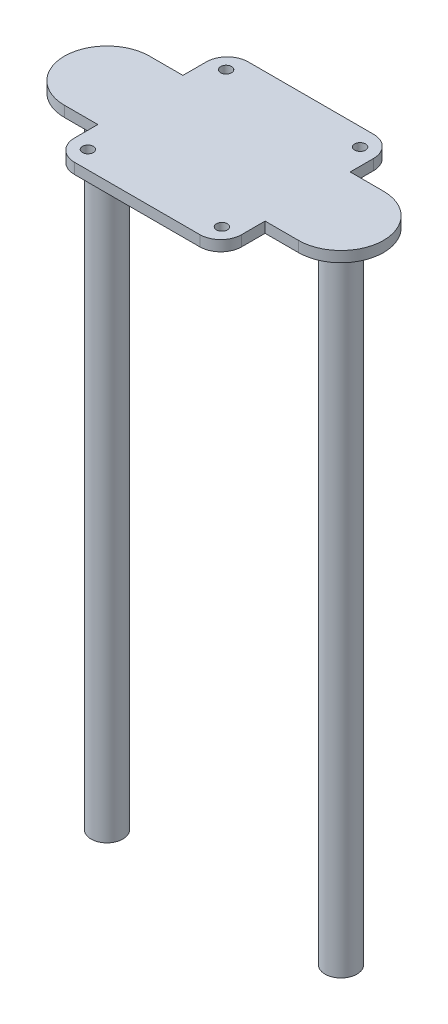
ISO-10303-21;
HEADER;
FILE_DESCRIPTION(('STEP AP214'),'2;1');
FILE_NAME('part.step','',(''),(''),'','','');
FILE_SCHEMA(('AUTOMOTIVE_DESIGN { 1 0 10303 214 1 1 1 1 }'));
ENDSEC;
DATA;
#1=APPLICATION_CONTEXT('core data for automotive mechanical design processes');
#2=APPLICATION_PROTOCOL_DEFINITION('international standard','automotive_design',2000,#1);
#3=PRODUCT_CONTEXT('',#1,'mechanical');
#4=PRODUCT('Part','Part','',(#3));
#5=PRODUCT_RELATED_PRODUCT_CATEGORY('part','',(#4));
#6=PRODUCT_DEFINITION_FORMATION('','',#4);
#7=PRODUCT_DEFINITION_CONTEXT('part definition',#1,'design');
#8=PRODUCT_DEFINITION('design','',#6,#7);
#9=PRODUCT_DEFINITION_SHAPE('','',#8);
#10=(LENGTH_UNIT() NAMED_UNIT(*) SI_UNIT(.MILLI.,.METRE.));
#11=(NAMED_UNIT(*) PLANE_ANGLE_UNIT() SI_UNIT($,.RADIAN.));
#12=(NAMED_UNIT(*) SI_UNIT($,.STERADIAN.) SOLID_ANGLE_UNIT());
#13=UNCERTAINTY_MEASURE_WITH_UNIT(LENGTH_MEASURE(1.E-05),#10,'distance_accuracy_value','');
#14=(GEOMETRIC_REPRESENTATION_CONTEXT(3) GLOBAL_UNCERTAINTY_ASSIGNED_CONTEXT((#13)) GLOBAL_UNIT_ASSIGNED_CONTEXT((#10,
#11,#12)) REPRESENTATION_CONTEXT('',''));
#15=CARTESIAN_POINT('',(0.,0.,0.));
#16=DIRECTION('',(0.,0.,1.));
#17=DIRECTION('',(1.,0.,0.));
#18=AXIS2_PLACEMENT_3D('',#15,#16,#17);
#19=CARTESIAN_POINT('',(-27.94,2.54,0.));
#20=DIRECTION('',(0.,-1.,0.));
#21=DIRECTION('',(0.,0.,-1.));
#22=AXIS2_PLACEMENT_3D('',#19,#20,#21);
#23=CYLINDRICAL_SURFACE('',#22,10.16);
#24=CARTESIAN_POINT('',(-27.94,0.,0.));
#25=DIRECTION('',(0.,1.,0.));
#26=DIRECTION('',(0.,0.,1.));
#27=AXIS2_PLACEMENT_3D('',#24,#25,#26);
#28=CIRCLE('',#27,10.16);
#29=CARTESIAN_POINT('',(-27.94,0.,10.16));
#30=VERTEX_POINT('',#29);
#31=CARTESIAN_POINT('',(-27.94,0.,-10.16));
#32=VERTEX_POINT('',#31);
#33=EDGE_CURVE('E189',#30,#32,#28,.F.);
#34=ORIENTED_EDGE('',*,*,#33,.F.);
#35=DIRECTION('',(0.,-1.,0.));
#36=VECTOR('',#35,1.);
#37=CARTESIAN_POINT('',(-27.94,2.54,10.16));
#38=LINE('',#37,#36);
#39=CARTESIAN_POINT('',(-27.94,2.54,10.16));
#40=VERTEX_POINT('',#39);
#41=EDGE_CURVE('E11',#40,#30,#38,.T.);
#42=ORIENTED_EDGE('',*,*,#41,.F.);
#43=CARTESIAN_POINT('',(-27.94,2.54,0.));
#44=DIRECTION('',(0.,1.,0.));
#45=DIRECTION('',(0.,0.,1.));
#46=AXIS2_PLACEMENT_3D('',#43,#44,#45);
#47=CIRCLE('',#46,10.16);
#48=CARTESIAN_POINT('',(-27.94,2.54,-10.16));
#49=VERTEX_POINT('',#48);
#50=EDGE_CURVE('E242',#40,#49,#47,.F.);
#51=ORIENTED_EDGE('',*,*,#50,.T.);
#52=DIRECTION('',(0.,-1.,0.));
#53=VECTOR('',#52,1.);
#54=CARTESIAN_POINT('',(-27.94,2.54,-10.16));
#55=LINE('',#54,#53);
#56=EDGE_CURVE('E49',#49,#32,#55,.T.);
#57=ORIENTED_EDGE('',*,*,#56,.T.);
#58=EDGE_LOOP('',(#34,#42,#51,#57));
#59=FACE_BOUND('',#58,.T.);
#60=ADVANCED_FACE('F33',(#59),#23,.T.);
#61=CARTESIAN_POINT('',(0.,2.54,10.16));
#62=DIRECTION('',(0.,0.,-1.));
#63=DIRECTION('',(-1.,0.,0.));
#64=AXIS2_PLACEMENT_3D('',#61,#62,#63);
#65=PLANE('',#64);
#66=DIRECTION('',(1.,0.,0.));
#67=VECTOR('',#66,1.);
#68=CARTESIAN_POINT('',(0.,0.,10.16));
#69=LINE('',#68,#67);
#70=CARTESIAN_POINT('',(-19.9694290716853,0.,10.16));
#71=VERTEX_POINT('',#70);
#72=EDGE_CURVE('E191',#30,#71,#69,.T.);
#73=ORIENTED_EDGE('',*,*,#72,.T.);
#74=DIRECTION('',(0.,-1.,0.));
#75=VECTOR('',#74,1.);
#76=CARTESIAN_POINT('',(-19.9694290716853,2.54,10.16));
#77=LINE('',#76,#75);
#78=CARTESIAN_POINT('',(-19.9694290716853,2.54,10.16));
#79=VERTEX_POINT('',#78);
#80=EDGE_CURVE('E41',#79,#71,#77,.T.);
#81=ORIENTED_EDGE('',*,*,#80,.F.);
#82=DIRECTION('',(1.,0.,0.));
#83=VECTOR('',#82,1.);
#84=CARTESIAN_POINT('',(0.,2.54,10.16));
#85=LINE('',#84,#83);
#86=EDGE_CURVE('E433',#40,#79,#85,.T.);
#87=ORIENTED_EDGE('',*,*,#86,.F.);
#88=ORIENTED_EDGE('',*,*,#41,.T.);
#89=EDGE_LOOP('',(#73,#81,#87,#88));
#90=FACE_BOUND('',#89,.T.);
#91=ADVANCED_FACE('F339',(#90),#65,.F.);
#92=CARTESIAN_POINT('',(-19.9694290716853,2.54,0.));
#93=DIRECTION('',(1.,0.,0.));
#94=DIRECTION('',(0.,0.,-1.));
#95=AXIS2_PLACEMENT_3D('',#92,#93,#94);
#96=PLANE('',#95);
#97=DIRECTION('',(0.,0.,1.));
#98=VECTOR('',#97,1.);
#99=CARTESIAN_POINT('',(-19.9694290716853,0.,0.));
#100=LINE('',#99,#98);
#101=CARTESIAN_POINT('',(-19.9694290716853,0.,15.75));
#102=VERTEX_POINT('',#101);
#103=EDGE_CURVE('E194',#71,#102,#100,.T.);
#104=ORIENTED_EDGE('',*,*,#103,.T.);
#105=DIRECTION('',(0.,-1.,0.));
#106=VECTOR('',#105,1.);
#107=CARTESIAN_POINT('',(-19.9694290716853,2.54,15.75));
#108=LINE('',#107,#106);
#109=CARTESIAN_POINT('',(-19.9694290716853,2.54,15.75));
#110=VERTEX_POINT('',#109);
#111=EDGE_CURVE('E266',#110,#102,#108,.T.);
#112=ORIENTED_EDGE('',*,*,#111,.F.);
#113=DIRECTION('',(0.,0.,1.));
#114=VECTOR('',#113,1.);
#115=CARTESIAN_POINT('',(-19.9694290716853,2.54,0.));
#116=LINE('',#115,#114);
#117=EDGE_CURVE('E275',#79,#110,#116,.T.);
#118=ORIENTED_EDGE('',*,*,#117,.F.);
#119=ORIENTED_EDGE('',*,*,#80,.T.);
#120=EDGE_LOOP('',(#104,#112,#118,#119));
#121=FACE_BOUND('',#120,.T.);
#122=ADVANCED_FACE('F273',(#121),#96,.F.);
#123=CARTESIAN_POINT('',(-14.9694290716853,2.54,15.75));
#124=DIRECTION('',(0.,-1.,0.));
#125=DIRECTION('',(0.,0.,-1.));
#126=AXIS2_PLACEMENT_3D('',#123,#124,#125);
#127=CYLINDRICAL_SURFACE('',#126,5.);
#128=CARTESIAN_POINT('',(-14.9694290716853,0.,15.75));
#129=DIRECTION('',(0.,1.,0.));
#130=DIRECTION('',(0.,0.,1.));
#131=AXIS2_PLACEMENT_3D('',#128,#129,#130);
#132=CIRCLE('',#131,5.);
#133=CARTESIAN_POINT('',(-14.9694290716853,0.,20.75));
#134=VERTEX_POINT('',#133);
#135=EDGE_CURVE('E196',#102,#134,#132,.T.);
#136=ORIENTED_EDGE('',*,*,#135,.T.);
#137=DIRECTION('',(0.,-1.,0.));
#138=VECTOR('',#137,1.);
#139=CARTESIAN_POINT('',(-14.9694290716853,2.54,20.75));
#140=LINE('',#139,#138);
#141=CARTESIAN_POINT('',(-14.9694290716853,2.54,20.75));
#142=VERTEX_POINT('',#141);
#143=EDGE_CURVE('E263',#142,#134,#140,.T.);
#144=ORIENTED_EDGE('',*,*,#143,.F.);
#145=CARTESIAN_POINT('',(-14.9694290716853,2.54,15.75));
#146=DIRECTION('',(0.,1.,0.));
#147=DIRECTION('',(0.,0.,1.));
#148=AXIS2_PLACEMENT_3D('',#145,#146,#147);
#149=CIRCLE('',#148,5.);
#150=EDGE_CURVE('E295',#110,#142,#149,.T.);
#151=ORIENTED_EDGE('',*,*,#150,.F.);
#152=ORIENTED_EDGE('',*,*,#111,.T.);
#153=EDGE_LOOP('',(#136,#144,#151,#152));
#154=FACE_BOUND('',#153,.T.);
#155=ADVANCED_FACE('F285',(#154),#127,.T.);
#156=CARTESIAN_POINT('',(0.,2.54,20.75));
#157=DIRECTION('',(0.,0.,-1.));
#158=DIRECTION('',(-1.,0.,0.));
#159=AXIS2_PLACEMENT_3D('',#156,#157,#158);
#160=PLANE('',#159);
#161=DIRECTION('',(1.,0.,0.));
#162=VECTOR('',#161,1.);
#163=CARTESIAN_POINT('',(0.,0.,20.75));
#164=LINE('',#163,#162);
#165=CARTESIAN_POINT('',(14.9694290716853,0.,20.75));
#166=VERTEX_POINT('',#165);
#167=EDGE_CURVE('E198',#134,#166,#164,.T.);
#168=ORIENTED_EDGE('',*,*,#167,.T.);
#169=DIRECTION('',(0.,-1.,0.));
#170=VECTOR('',#169,1.);
#171=CARTESIAN_POINT('',(14.9694290716853,2.54,20.75));
#172=LINE('',#171,#170);
#173=CARTESIAN_POINT('',(14.9694290716853,2.54,20.75));
#174=VERTEX_POINT('',#173);
#175=EDGE_CURVE('E261',#174,#166,#172,.T.);
#176=ORIENTED_EDGE('',*,*,#175,.F.);
#177=DIRECTION('',(1.,0.,0.));
#178=VECTOR('',#177,1.);
#179=CARTESIAN_POINT('',(0.,2.54,20.75));
#180=LINE('',#179,#178);
#181=EDGE_CURVE('E291',#142,#174,#180,.T.);
#182=ORIENTED_EDGE('',*,*,#181,.F.);
#183=ORIENTED_EDGE('',*,*,#143,.T.);
#184=EDGE_LOOP('',(#168,#176,#182,#183));
#185=FACE_BOUND('',#184,.T.);
#186=ADVANCED_FACE('F289',(#185),#160,.F.);
#187=CARTESIAN_POINT('',(14.9694290716853,2.54,15.75));
#188=DIRECTION('',(0.,-1.,0.));
#189=DIRECTION('',(0.,0.,-1.));
#190=AXIS2_PLACEMENT_3D('',#187,#188,#189);
#191=CYLINDRICAL_SURFACE('',#190,5.);
#192=CARTESIAN_POINT('',(14.9694290716853,0.,15.75));
#193=DIRECTION('',(0.,1.,0.));
#194=DIRECTION('',(0.,0.,1.));
#195=AXIS2_PLACEMENT_3D('',#192,#193,#194);
#196=CIRCLE('',#195,5.);
#197=CARTESIAN_POINT('',(19.9694290716853,0.,15.75));
#198=VERTEX_POINT('',#197);
#199=EDGE_CURVE('E201',#198,#166,#196,.F.);
#200=ORIENTED_EDGE('',*,*,#199,.F.);
#201=DIRECTION('',(0.,-1.,0.));
#202=VECTOR('',#201,1.);
#203=CARTESIAN_POINT('',(19.9694290716853,2.54,15.75));
#204=LINE('',#203,#202);
#205=CARTESIAN_POINT('',(19.9694290716853,2.54,15.75));
#206=VERTEX_POINT('',#205);
#207=EDGE_CURVE('E259',#206,#198,#204,.T.);
#208=ORIENTED_EDGE('',*,*,#207,.F.);
#209=CARTESIAN_POINT('',(14.9694290716853,2.54,15.75));
#210=DIRECTION('',(0.,1.,0.));
#211=DIRECTION('',(0.,0.,1.));
#212=AXIS2_PLACEMENT_3D('',#209,#210,#211);
#213=CIRCLE('',#212,5.);
#214=EDGE_CURVE('E294',#206,#174,#213,.F.);
#215=ORIENTED_EDGE('',*,*,#214,.T.);
#216=ORIENTED_EDGE('',*,*,#175,.T.);
#217=EDGE_LOOP('',(#200,#208,#215,#216));
#218=FACE_BOUND('',#217,.T.);
#219=ADVANCED_FACE('F352',(#218),#191,.T.);
#220=CARTESIAN_POINT('',(19.9694290716853,2.54,0.));
#221=DIRECTION('',(1.,0.,0.));
#222=DIRECTION('',(0.,0.,-1.));
#223=AXIS2_PLACEMENT_3D('',#220,#221,#222);
#224=PLANE('',#223);
#225=DIRECTION('',(0.,0.,1.));
#226=VECTOR('',#225,1.);
#227=CARTESIAN_POINT('',(19.9694290716853,0.,0.));
#228=LINE('',#227,#226);
#229=CARTESIAN_POINT('',(19.9694290716853,0.,10.16));
#230=VERTEX_POINT('',#229);
#231=EDGE_CURVE('E204',#230,#198,#228,.T.);
#232=ORIENTED_EDGE('',*,*,#231,.F.);
#233=DIRECTION('',(0.,-1.,0.));
#234=VECTOR('',#233,1.);
#235=CARTESIAN_POINT('',(19.9694290716853,2.54,10.16));
#236=LINE('',#235,#234);
#237=CARTESIAN_POINT('',(19.9694290716853,2.54,10.16));
#238=VERTEX_POINT('',#237);
#239=EDGE_CURVE('E257',#238,#230,#236,.T.);
#240=ORIENTED_EDGE('',*,*,#239,.F.);
#241=DIRECTION('',(0.,0.,1.));
#242=VECTOR('',#241,1.);
#243=CARTESIAN_POINT('',(19.9694290716853,2.54,0.));
#244=LINE('',#243,#242);
#245=EDGE_CURVE('E297',#238,#206,#244,.T.);
#246=ORIENTED_EDGE('',*,*,#245,.T.);
#247=ORIENTED_EDGE('',*,*,#207,.T.);
#248=EDGE_LOOP('',(#232,#240,#246,#247));
#249=FACE_BOUND('',#248,.T.);
#250=ADVANCED_FACE('F355',(#249),#224,.T.);
#251=CARTESIAN_POINT('',(0.,2.54,10.16));
#252=DIRECTION('',(0.,0.,-1.));
#253=DIRECTION('',(-1.,0.,0.));
#254=AXIS2_PLACEMENT_3D('',#251,#252,#253);
#255=PLANE('',#254);
#256=DIRECTION('',(1.,0.,0.));
#257=VECTOR('',#256,1.);
#258=CARTESIAN_POINT('',(0.,0.,10.16));
#259=LINE('',#258,#257);
#260=CARTESIAN_POINT('',(27.94,0.,10.16));
#261=VERTEX_POINT('',#260);
#262=EDGE_CURVE('E207',#230,#261,#259,.T.);
#263=ORIENTED_EDGE('',*,*,#262,.T.);
#264=DIRECTION('',(0.,-1.,0.));
#265=VECTOR('',#264,1.);
#266=CARTESIAN_POINT('',(27.94,2.54,10.16));
#267=LINE('',#266,#265);
#268=CARTESIAN_POINT('',(27.94,2.54,10.16));
#269=VERTEX_POINT('',#268);
#270=EDGE_CURVE('E254',#269,#261,#267,.T.);
#271=ORIENTED_EDGE('',*,*,#270,.F.);
#272=DIRECTION('',(1.,0.,0.));
#273=VECTOR('',#272,1.);
#274=CARTESIAN_POINT('',(0.,2.54,10.16));
#275=LINE('',#274,#273);
#276=EDGE_CURVE('E304',#238,#269,#275,.T.);
#277=ORIENTED_EDGE('',*,*,#276,.F.);
#278=ORIENTED_EDGE('',*,*,#239,.T.);
#279=EDGE_LOOP('',(#263,#271,#277,#278));
#280=FACE_BOUND('',#279,.T.);
#281=ADVANCED_FACE('F359',(#280),#255,.F.);
#282=CARTESIAN_POINT('',(27.94,2.54,0.));
#283=DIRECTION('',(0.,-1.,0.));
#284=DIRECTION('',(0.,0.,-1.));
#285=AXIS2_PLACEMENT_3D('',#282,#283,#284);
#286=CYLINDRICAL_SURFACE('',#285,10.16);
#287=CARTESIAN_POINT('',(27.94,0.,0.));
#288=DIRECTION('',(0.,1.,0.));
#289=DIRECTION('',(0.,0.,1.));
#290=AXIS2_PLACEMENT_3D('',#287,#288,#289);
#291=CIRCLE('',#290,10.16);
#292=CARTESIAN_POINT('',(27.94,0.,-10.16));
#293=VERTEX_POINT('',#292);
#294=EDGE_CURVE('E209',#261,#293,#291,.T.);
#295=ORIENTED_EDGE('',*,*,#294,.T.);
#296=DIRECTION('',(0.,-1.,0.));
#297=VECTOR('',#296,1.);
#298=CARTESIAN_POINT('',(27.94,2.54,-10.16));
#299=LINE('',#298,#297);
#300=CARTESIAN_POINT('',(27.94,2.54,-10.16));
#301=VERTEX_POINT('',#300);
#302=EDGE_CURVE('E252',#301,#293,#299,.T.);
#303=ORIENTED_EDGE('',*,*,#302,.F.);
#304=CARTESIAN_POINT('',(27.94,2.54,0.));
#305=DIRECTION('',(0.,1.,0.));
#306=DIRECTION('',(0.,0.,1.));
#307=AXIS2_PLACEMENT_3D('',#304,#305,#306);
#308=CIRCLE('',#307,10.16);
#309=EDGE_CURVE('E306',#269,#301,#308,.T.);
#310=ORIENTED_EDGE('',*,*,#309,.F.);
#311=ORIENTED_EDGE('',*,*,#270,.T.);
#312=EDGE_LOOP('',(#295,#303,#310,#311));
#313=FACE_BOUND('',#312,.T.);
#314=ADVANCED_FACE('F363',(#313),#286,.T.);
#315=CARTESIAN_POINT('',(0.,2.54,-10.16));
#316=DIRECTION('',(0.,0.,-1.));
#317=DIRECTION('',(-1.,0.,0.));
#318=AXIS2_PLACEMENT_3D('',#315,#316,#317);
#319=PLANE('',#318);
#320=DIRECTION('',(1.,0.,0.));
#321=VECTOR('',#320,1.);
#322=CARTESIAN_POINT('',(0.,0.,-10.16));
#323=LINE('',#322,#321);
#324=CARTESIAN_POINT('',(19.9694290716853,0.,-10.16));
#325=VERTEX_POINT('',#324);
#326=EDGE_CURVE('E212',#325,#293,#323,.T.);
#327=ORIENTED_EDGE('',*,*,#326,.F.);
#328=DIRECTION('',(0.,-1.,0.));
#329=VECTOR('',#328,1.);
#330=CARTESIAN_POINT('',(19.9694290716853,2.54,-10.16));
#331=LINE('',#330,#329);
#332=CARTESIAN_POINT('',(19.9694290716853,2.54,-10.16));
#333=VERTEX_POINT('',#332);
#334=EDGE_CURVE('E250',#333,#325,#331,.T.);
#335=ORIENTED_EDGE('',*,*,#334,.F.);
#336=DIRECTION('',(1.,0.,0.));
#337=VECTOR('',#336,1.);
#338=CARTESIAN_POINT('',(0.,2.54,-10.16));
#339=LINE('',#338,#337);
#340=EDGE_CURVE('E308',#333,#301,#339,.T.);
#341=ORIENTED_EDGE('',*,*,#340,.T.);
#342=ORIENTED_EDGE('',*,*,#302,.T.);
#343=EDGE_LOOP('',(#327,#335,#341,#342));
#344=FACE_BOUND('',#343,.T.);
#345=ADVANCED_FACE('F367',(#344),#319,.T.);
#346=CARTESIAN_POINT('',(19.9694290716853,2.54,0.));
#347=DIRECTION('',(1.,0.,0.));
#348=DIRECTION('',(0.,0.,-1.));
#349=AXIS2_PLACEMENT_3D('',#346,#347,#348);
#350=PLANE('',#349);
#351=DIRECTION('',(0.,0.,1.));
#352=VECTOR('',#351,1.);
#353=CARTESIAN_POINT('',(19.9694290716853,0.,0.));
#354=LINE('',#353,#352);
#355=CARTESIAN_POINT('',(19.9694290716853,0.,-15.75));
#356=VERTEX_POINT('',#355);
#357=EDGE_CURVE('E215',#356,#325,#354,.T.);
#358=ORIENTED_EDGE('',*,*,#357,.F.);
#359=DIRECTION('',(0.,-1.,0.));
#360=VECTOR('',#359,1.);
#361=CARTESIAN_POINT('',(19.9694290716853,2.54,-15.75));
#362=LINE('',#361,#360);
#363=CARTESIAN_POINT('',(19.9694290716853,2.54,-15.75));
#364=VERTEX_POINT('',#363);
#365=EDGE_CURVE('E248',#364,#356,#362,.T.);
#366=ORIENTED_EDGE('',*,*,#365,.F.);
#367=DIRECTION('',(0.,0.,1.));
#368=VECTOR('',#367,1.);
#369=CARTESIAN_POINT('',(19.9694290716853,2.54,0.));
#370=LINE('',#369,#368);
#371=EDGE_CURVE('E311',#364,#333,#370,.T.);
#372=ORIENTED_EDGE('',*,*,#371,.T.);
#373=ORIENTED_EDGE('',*,*,#334,.T.);
#374=EDGE_LOOP('',(#358,#366,#372,#373));
#375=FACE_BOUND('',#374,.T.);
#376=ADVANCED_FACE('F371',(#375),#350,.T.);
#377=CARTESIAN_POINT('',(14.9694290716853,2.54,-15.75));
#378=DIRECTION('',(0.,-1.,0.));
#379=DIRECTION('',(0.,0.,-1.));
#380=AXIS2_PLACEMENT_3D('',#377,#378,#379);
#381=CYLINDRICAL_SURFACE('',#380,5.);
#382=CARTESIAN_POINT('',(14.9694290716853,0.,-15.75));
#383=DIRECTION('',(0.,1.,0.));
#384=DIRECTION('',(0.,0.,1.));
#385=AXIS2_PLACEMENT_3D('',#382,#383,#384);
#386=CIRCLE('',#385,5.);
#387=CARTESIAN_POINT('',(14.9694290716853,0.,-20.75));
#388=VERTEX_POINT('',#387);
#389=EDGE_CURVE('E218',#356,#388,#386,.T.);
#390=ORIENTED_EDGE('',*,*,#389,.T.);
#391=DIRECTION('',(0.,-1.,0.));
#392=VECTOR('',#391,1.);
#393=CARTESIAN_POINT('',(14.9694290716853,2.54,-20.75));
#394=LINE('',#393,#392);
#395=CARTESIAN_POINT('',(14.9694290716853,2.54,-20.75));
#396=VERTEX_POINT('',#395);
#397=EDGE_CURVE('E246',#396,#388,#394,.T.);
#398=ORIENTED_EDGE('',*,*,#397,.F.);
#399=CARTESIAN_POINT('',(14.9694290716853,2.54,-15.75));
#400=DIRECTION('',(0.,1.,0.));
#401=DIRECTION('',(0.,0.,1.));
#402=AXIS2_PLACEMENT_3D('',#399,#400,#401);
#403=CIRCLE('',#402,5.);
#404=EDGE_CURVE('E172',#364,#396,#403,.T.);
#405=ORIENTED_EDGE('',*,*,#404,.F.);
#406=ORIENTED_EDGE('',*,*,#365,.T.);
#407=EDGE_LOOP('',(#390,#398,#405,#406));
#408=FACE_BOUND('',#407,.T.);
#409=ADVANCED_FACE('F318',(#408),#381,.T.);
#410=CARTESIAN_POINT('',(0.,2.54,-20.75));
#411=DIRECTION('',(0.,0.,-1.));
#412=DIRECTION('',(-1.,0.,0.));
#413=AXIS2_PLACEMENT_3D('',#410,#411,#412);
#414=PLANE('',#413);
#415=DIRECTION('',(1.,0.,0.));
#416=VECTOR('',#415,1.);
#417=CARTESIAN_POINT('',(0.,0.,-20.75));
#418=LINE('',#417,#416);
#419=CARTESIAN_POINT('',(-14.9694290716853,0.,-20.75));
#420=VERTEX_POINT('',#419);
#421=EDGE_CURVE('E221',#420,#388,#418,.T.);
#422=ORIENTED_EDGE('',*,*,#421,.F.);
#423=DIRECTION('',(0.,-1.,0.));
#424=VECTOR('',#423,1.);
#425=CARTESIAN_POINT('',(-14.9694290716853,2.54,-20.75));
#426=LINE('',#425,#424);
#427=CARTESIAN_POINT('',(-14.9694290716853,2.54,-20.75));
#428=VERTEX_POINT('',#427);
#429=EDGE_CURVE('E157',#428,#420,#426,.T.);
#430=ORIENTED_EDGE('',*,*,#429,.F.);
#431=DIRECTION('',(1.,0.,0.));
#432=VECTOR('',#431,1.);
#433=CARTESIAN_POINT('',(0.,2.54,-20.75));
#434=LINE('',#433,#432);
#435=EDGE_CURVE('E170',#428,#396,#434,.T.);
#436=ORIENTED_EDGE('',*,*,#435,.T.);
#437=ORIENTED_EDGE('',*,*,#397,.T.);
#438=EDGE_LOOP('',(#422,#430,#436,#437));
#439=FACE_BOUND('',#438,.T.);
#440=ADVANCED_FACE('F322',(#439),#414,.T.);
#441=CARTESIAN_POINT('',(-14.9694290716853,2.54,-15.75));
#442=DIRECTION('',(0.,-1.,0.));
#443=DIRECTION('',(0.,0.,-1.));
#444=AXIS2_PLACEMENT_3D('',#441,#442,#443);
#445=CYLINDRICAL_SURFACE('',#444,5.);
#446=CARTESIAN_POINT('',(-14.9694290716853,0.,-15.75));
#447=DIRECTION('',(0.,1.,0.));
#448=DIRECTION('',(0.,0.,1.));
#449=AXIS2_PLACEMENT_3D('',#446,#447,#448);
#450=CIRCLE('',#449,5.);
#451=CARTESIAN_POINT('',(-19.9694290716853,0.,-15.75));
#452=VERTEX_POINT('',#451);
#453=EDGE_CURVE('E154',#452,#420,#450,.F.);
#454=ORIENTED_EDGE('',*,*,#453,.F.);
#455=DIRECTION('',(0.,-1.,0.));
#456=VECTOR('',#455,1.);
#457=CARTESIAN_POINT('',(-19.9694290716853,2.54,-15.75));
#458=LINE('',#457,#456);
#459=CARTESIAN_POINT('',(-19.9694290716853,2.54,-15.75));
#460=VERTEX_POINT('',#459);
#461=EDGE_CURVE('E148',#460,#452,#458,.T.);
#462=ORIENTED_EDGE('',*,*,#461,.F.);
#463=CARTESIAN_POINT('',(-14.9694290716853,2.54,-15.75));
#464=DIRECTION('',(0.,1.,0.));
#465=DIRECTION('',(0.,0.,1.));
#466=AXIS2_PLACEMENT_3D('',#463,#464,#465);
#467=CIRCLE('',#466,5.);
#468=EDGE_CURVE('E152',#460,#428,#467,.F.);
#469=ORIENTED_EDGE('',*,*,#468,.T.);
#470=ORIENTED_EDGE('',*,*,#429,.T.);
#471=EDGE_LOOP('',(#454,#462,#469,#470));
#472=FACE_BOUND('',#471,.T.);
#473=ADVANCED_FACE('F150',(#472),#445,.T.);
#474=CARTESIAN_POINT('',(-19.9694290716853,2.54,0.));
#475=DIRECTION('',(1.,0.,0.));
#476=DIRECTION('',(0.,0.,-1.));
#477=AXIS2_PLACEMENT_3D('',#474,#475,#476);
#478=PLANE('',#477);
#479=DIRECTION('',(0.,0.,1.));
#480=VECTOR('',#479,1.);
#481=CARTESIAN_POINT('',(-19.9694290716853,0.,0.));
#482=LINE('',#481,#480);
#483=CARTESIAN_POINT('',(-19.9694290716853,0.,-10.16));
#484=VERTEX_POINT('',#483);
#485=EDGE_CURVE('E225',#452,#484,#482,.T.);
#486=ORIENTED_EDGE('',*,*,#485,.T.);
#487=DIRECTION('',(0.,-1.,0.));
#488=VECTOR('',#487,1.);
#489=CARTESIAN_POINT('',(-19.9694290716853,2.54,-10.16));
#490=LINE('',#489,#488);
#491=CARTESIAN_POINT('',(-19.9694290716853,2.54,-10.16));
#492=VERTEX_POINT('',#491);
#493=EDGE_CURVE('E99',#492,#484,#490,.T.);
#494=ORIENTED_EDGE('',*,*,#493,.F.);
#495=DIRECTION('',(0.,0.,1.));
#496=VECTOR('',#495,1.);
#497=CARTESIAN_POINT('',(-19.9694290716853,2.54,0.));
#498=LINE('',#497,#496);
#499=EDGE_CURVE('E159',#460,#492,#498,.T.);
#500=ORIENTED_EDGE('',*,*,#499,.F.);
#501=ORIENTED_EDGE('',*,*,#461,.T.);
#502=EDGE_LOOP('',(#486,#494,#500,#501));
#503=FACE_BOUND('',#502,.T.);
#504=ADVANCED_FACE('F160',(#503),#478,.F.);
#505=CARTESIAN_POINT('',(-16.,2.54,-16.5));
#506=DIRECTION('',(0.,-1.,0.));
#507=DIRECTION('',(0.,0.,-1.));
#508=AXIS2_PLACEMENT_3D('',#505,#506,#507);
#509=CYLINDRICAL_SURFACE('',#508,1.30000000000001);
#510=CARTESIAN_POINT('',(-16.,2.54,-16.5));
#511=DIRECTION('',(0.,1.,0.));
#512=DIRECTION('',(0.,0.,1.));
#513=AXIS2_PLACEMENT_3D('',#510,#511,#512);
#514=CIRCLE('',#513,1.30000000000001);
#515=CARTESIAN_POINT('',(-16.,2.54,-15.2));
#516=VERTEX_POINT('',#515);
#517=EDGE_CURVE('E183',#516,#516,#514,.T.);
#518=ORIENTED_EDGE('',*,*,#517,.T.);
#519=EDGE_LOOP('',(#518));
#520=FACE_BOUND('',#519,.T.);
#521=CARTESIAN_POINT('',(-16.,0.,-16.5));
#522=DIRECTION('',(0.,1.,0.));
#523=DIRECTION('',(0.,0.,1.));
#524=AXIS2_PLACEMENT_3D('',#521,#522,#523);
#525=CIRCLE('',#524,1.30000000000001);
#526=CARTESIAN_POINT('',(-16.,0.,-15.2));
#527=VERTEX_POINT('',#526);
#528=EDGE_CURVE('E236',#527,#527,#525,.T.);
#529=ORIENTED_EDGE('',*,*,#528,.F.);
#530=EDGE_LOOP('',(#529));
#531=FACE_BOUND('',#530,.T.);
#532=ADVANCED_FACE('F382',(#520,#531),#509,.F.);
#533=CARTESIAN_POINT('',(-16.,2.54,16.5));
#534=DIRECTION('',(0.,-1.,0.));
#535=DIRECTION('',(0.,0.,-1.));
#536=AXIS2_PLACEMENT_3D('',#533,#534,#535);
#537=CYLINDRICAL_SURFACE('',#536,1.3);
#538=CARTESIAN_POINT('',(-16.,2.54,16.5));
#539=DIRECTION('',(0.,1.,0.));
#540=DIRECTION('',(0.,0.,1.));
#541=AXIS2_PLACEMENT_3D('',#538,#539,#540);
#542=CIRCLE('',#541,1.3);
#543=CARTESIAN_POINT('',(-16.,2.54,17.8));
#544=VERTEX_POINT('',#543);
#545=EDGE_CURVE('E180',#544,#544,#542,.T.);
#546=ORIENTED_EDGE('',*,*,#545,.T.);
#547=EDGE_LOOP('',(#546));
#548=FACE_BOUND('',#547,.T.);
#549=CARTESIAN_POINT('',(-16.,0.,16.5));
#550=DIRECTION('',(0.,1.,0.));
#551=DIRECTION('',(0.,0.,1.));
#552=AXIS2_PLACEMENT_3D('',#549,#550,#551);
#553=CIRCLE('',#552,1.3);
#554=CARTESIAN_POINT('',(-16.,0.,17.8));
#555=VERTEX_POINT('',#554);
#556=EDGE_CURVE('E233',#555,#555,#553,.T.);
#557=ORIENTED_EDGE('',*,*,#556,.F.);
#558=EDGE_LOOP('',(#557));
#559=FACE_BOUND('',#558,.T.);
#560=ADVANCED_FACE('F334',(#548,#559),#537,.F.);
#561=CARTESIAN_POINT('',(16.,2.54,16.5));
#562=DIRECTION('',(0.,-1.,0.));
#563=DIRECTION('',(0.,0.,-1.));
#564=AXIS2_PLACEMENT_3D('',#561,#562,#563);
#565=CYLINDRICAL_SURFACE('',#564,1.29999999999999);
#566=CARTESIAN_POINT('',(16.,2.54,16.5));
#567=DIRECTION('',(0.,1.,0.));
#568=DIRECTION('',(0.,0.,1.));
#569=AXIS2_PLACEMENT_3D('',#566,#567,#568);
#570=CIRCLE('',#569,1.29999999999999);
#571=CARTESIAN_POINT('',(16.,2.54,17.8));
#572=VERTEX_POINT('',#571);
#573=EDGE_CURVE('E177',#572,#572,#570,.T.);
#574=ORIENTED_EDGE('',*,*,#573,.T.);
#575=EDGE_LOOP('',(#574));
#576=FACE_BOUND('',#575,.T.);
#577=CARTESIAN_POINT('',(16.,0.,16.5));
#578=DIRECTION('',(0.,1.,0.));
#579=DIRECTION('',(0.,0.,1.));
#580=AXIS2_PLACEMENT_3D('',#577,#578,#579);
#581=CIRCLE('',#580,1.29999999999999);
#582=CARTESIAN_POINT('',(16.,0.,17.8));
#583=VERTEX_POINT('',#582);
#584=EDGE_CURVE('E230',#583,#583,#581,.T.);
#585=ORIENTED_EDGE('',*,*,#584,.F.);
#586=EDGE_LOOP('',(#585));
#587=FACE_BOUND('',#586,.T.);
#588=ADVANCED_FACE('F326',(#576,#587),#565,.F.);
#589=CARTESIAN_POINT('',(0.,2.54,-10.16));
#590=DIRECTION('',(0.,0.,-1.));
#591=DIRECTION('',(-1.,0.,0.));
#592=AXIS2_PLACEMENT_3D('',#589,#590,#591);
#593=PLANE('',#592);
#594=DIRECTION('',(1.,0.,0.));
#595=VECTOR('',#594,1.);
#596=CARTESIAN_POINT('',(0.,0.,-10.16));
#597=LINE('',#596,#595);
#598=EDGE_CURVE('E227',#32,#484,#597,.T.);
#599=ORIENTED_EDGE('',*,*,#598,.F.);
#600=ORIENTED_EDGE('',*,*,#56,.F.);
#601=DIRECTION('',(1.,0.,0.));
#602=VECTOR('',#601,1.);
#603=CARTESIAN_POINT('',(0.,2.54,-10.16));
#604=LINE('',#603,#602);
#605=EDGE_CURVE('E163',#49,#492,#604,.T.);
#606=ORIENTED_EDGE('',*,*,#605,.T.);
#607=ORIENTED_EDGE('',*,*,#493,.T.);
#608=EDGE_LOOP('',(#599,#600,#606,#607));
#609=FACE_BOUND('',#608,.T.);
#610=ADVANCED_FACE('F323',(#609),#593,.T.);
#611=CARTESIAN_POINT('',(16.,2.54,-16.5));
#612=DIRECTION('',(0.,-1.,0.));
#613=DIRECTION('',(0.,0.,-1.));
#614=AXIS2_PLACEMENT_3D('',#611,#612,#613);
#615=CYLINDRICAL_SURFACE('',#614,1.3);
#616=CARTESIAN_POINT('',(16.,2.54,-16.5));
#617=DIRECTION('',(0.,1.,0.));
#618=DIRECTION('',(0.,0.,1.));
#619=AXIS2_PLACEMENT_3D('',#616,#617,#618);
#620=CIRCLE('',#619,1.3);
#621=CARTESIAN_POINT('',(16.,2.54,-15.2));
#622=VERTEX_POINT('',#621);
#623=EDGE_CURVE('E186',#622,#622,#620,.T.);
#624=ORIENTED_EDGE('',*,*,#623,.T.);
#625=EDGE_LOOP('',(#624));
#626=FACE_BOUND('',#625,.T.);
#627=CARTESIAN_POINT('',(16.,0.,-16.5));
#628=DIRECTION('',(0.,1.,0.));
#629=DIRECTION('',(0.,0.,1.));
#630=AXIS2_PLACEMENT_3D('',#627,#628,#629);
#631=CIRCLE('',#630,1.3);
#632=CARTESIAN_POINT('',(16.,0.,-15.2));
#633=VERTEX_POINT('',#632);
#634=EDGE_CURVE('E239',#633,#633,#631,.T.);
#635=ORIENTED_EDGE('',*,*,#634,.F.);
#636=EDGE_LOOP('',(#635));
#637=FACE_BOUND('',#636,.T.);
#638=ADVANCED_FACE('F325',(#626,#637),#615,.F.);
#639=CARTESIAN_POINT('',(0.,2.54,0.));
#640=DIRECTION('',(0.,1.,0.));
#641=DIRECTION('',(0.,0.,1.));
#642=AXIS2_PLACEMENT_3D('',#639,#640,#641);
#643=PLANE('',#642);
#644=ORIENTED_EDGE('',*,*,#50,.F.);
#645=ORIENTED_EDGE('',*,*,#86,.T.);
#646=ORIENTED_EDGE('',*,*,#117,.T.);
#647=ORIENTED_EDGE('',*,*,#150,.T.);
#648=ORIENTED_EDGE('',*,*,#181,.T.);
#649=ORIENTED_EDGE('',*,*,#214,.F.);
#650=ORIENTED_EDGE('',*,*,#245,.F.);
#651=ORIENTED_EDGE('',*,*,#276,.T.);
#652=ORIENTED_EDGE('',*,*,#309,.T.);
#653=ORIENTED_EDGE('',*,*,#340,.F.);
#654=ORIENTED_EDGE('',*,*,#371,.F.);
#655=ORIENTED_EDGE('',*,*,#404,.T.);
#656=ORIENTED_EDGE('',*,*,#435,.F.);
#657=ORIENTED_EDGE('',*,*,#468,.F.);
#658=ORIENTED_EDGE('',*,*,#499,.T.);
#659=ORIENTED_EDGE('',*,*,#605,.F.);
#660=EDGE_LOOP('',(#644,#645,#646,#647,#648,#649,#650,#651,#652,#653,#654,#655,#656,#657,#658,#659));
#661=FACE_BOUND('',#660,.T.);
#662=ORIENTED_EDGE('',*,*,#573,.F.);
#663=EDGE_LOOP('',(#662));
#664=FACE_BOUND('',#663,.T.);
#665=ORIENTED_EDGE('',*,*,#545,.F.);
#666=EDGE_LOOP('',(#665));
#667=FACE_BOUND('',#666,.T.);
#668=ORIENTED_EDGE('',*,*,#517,.F.);
#669=EDGE_LOOP('',(#668));
#670=FACE_BOUND('',#669,.T.);
#671=ORIENTED_EDGE('',*,*,#623,.F.);
#672=EDGE_LOOP('',(#671));
#673=FACE_BOUND('',#672,.T.);
#674=ADVANCED_FACE('F167',(#661,#664,#667,#670,#673),#643,.T.);
#675=CARTESIAN_POINT('',(0.,0.,0.));
#676=DIRECTION('',(0.,1.,0.));
#677=DIRECTION('',(0.,0.,1.));
#678=AXIS2_PLACEMENT_3D('',#675,#676,#677);
#679=PLANE('',#678);
#680=CARTESIAN_POINT('',(-27.94,0.,0.));
#681=DIRECTION('',(0.,1.,0.));
#682=DIRECTION('',(0.,0.,1.));
#683=AXIS2_PLACEMENT_3D('',#680,#681,#682);
#684=CIRCLE('',#683,3.81);
#685=CARTESIAN_POINT('',(-27.94,0.,3.81));
#686=VERTEX_POINT('',#685);
#687=EDGE_CURVE('E423',#686,#686,#684,.T.);
#688=ORIENTED_EDGE('',*,*,#687,.T.);
#689=EDGE_LOOP('',(#688));
#690=FACE_BOUND('',#689,.T.);
#691=CARTESIAN_POINT('',(27.94,0.,0.));
#692=DIRECTION('',(0.,1.,0.));
#693=DIRECTION('',(0.,0.,1.));
#694=AXIS2_PLACEMENT_3D('',#691,#692,#693);
#695=CIRCLE('',#694,3.81);
#696=CARTESIAN_POINT('',(27.94,0.,3.80999999999999));
#697=VERTEX_POINT('',#696);
#698=EDGE_CURVE('E424',#697,#697,#695,.T.);
#699=ORIENTED_EDGE('',*,*,#698,.T.);
#700=EDGE_LOOP('',(#699));
#701=FACE_BOUND('',#700,.T.);
#702=ORIENTED_EDGE('',*,*,#33,.T.);
#703=ORIENTED_EDGE('',*,*,#598,.T.);
#704=ORIENTED_EDGE('',*,*,#485,.F.);
#705=ORIENTED_EDGE('',*,*,#453,.T.);
#706=ORIENTED_EDGE('',*,*,#421,.T.);
#707=ORIENTED_EDGE('',*,*,#389,.F.);
#708=ORIENTED_EDGE('',*,*,#357,.T.);
#709=ORIENTED_EDGE('',*,*,#326,.T.);
#710=ORIENTED_EDGE('',*,*,#294,.F.);
#711=ORIENTED_EDGE('',*,*,#262,.F.);
#712=ORIENTED_EDGE('',*,*,#231,.T.);
#713=ORIENTED_EDGE('',*,*,#199,.T.);
#714=ORIENTED_EDGE('',*,*,#167,.F.);
#715=ORIENTED_EDGE('',*,*,#135,.F.);
#716=ORIENTED_EDGE('',*,*,#103,.F.);
#717=ORIENTED_EDGE('',*,*,#72,.F.);
#718=EDGE_LOOP('',(#702,#703,#704,#705,#706,#707,#708,#709,#710,#711,#712,#713,#714,#715,#716,#717));
#719=FACE_BOUND('',#718,.T.);
#720=ORIENTED_EDGE('',*,*,#584,.T.);
#721=EDGE_LOOP('',(#720));
#722=FACE_BOUND('',#721,.T.);
#723=ORIENTED_EDGE('',*,*,#556,.T.);
#724=EDGE_LOOP('',(#723));
#725=FACE_BOUND('',#724,.T.);
#726=ORIENTED_EDGE('',*,*,#528,.T.);
#727=EDGE_LOOP('',(#726));
#728=FACE_BOUND('',#727,.T.);
#729=ORIENTED_EDGE('',*,*,#634,.T.);
#730=EDGE_LOOP('',(#729));
#731=FACE_BOUND('',#730,.T.);
#732=ADVANCED_FACE('F280',(#690,#701,#719,#722,#725,#728,#731),#679,.F.);
#733=CARTESIAN_POINT('',(27.94,-152.4,0.));
#734=DIRECTION('',(0.,1.,0.));
#735=DIRECTION('',(0.,0.,1.));
#736=AXIS2_PLACEMENT_3D('',#733,#734,#735);
#737=CYLINDRICAL_SURFACE('',#736,3.81);
#738=CARTESIAN_POINT('',(27.94,-152.4,0.));
#739=DIRECTION('',(0.,1.,0.));
#740=DIRECTION('',(0.,0.,1.));
#741=AXIS2_PLACEMENT_3D('',#738,#739,#740);
#742=CIRCLE('',#741,3.81);
#743=CARTESIAN_POINT('',(27.94,-152.4,3.80999999999999));
#744=VERTEX_POINT('',#743);
#745=EDGE_CURVE('E192',#744,#744,#742,.T.);
#746=CARTESIAN_POINT('',(27.94,-152.4,3.80999999999999));
#747=CARTESIAN_POINT('',(27.94,-150.8125,3.80999999999999));
#748=CARTESIAN_POINT('',(27.94,-149.225,3.80999999999999));
#749=CARTESIAN_POINT('',(27.94,-146.05,3.80999999999999));
#750=CARTESIAN_POINT('',(27.94,-144.4625,3.80999999999999));
#751=CARTESIAN_POINT('',(27.94,-141.2875,3.80999999999999));
#752=CARTESIAN_POINT('',(27.94,-139.7,3.80999999999999));
#753=CARTESIAN_POINT('',(27.94,-136.525,3.80999999999999));
#754=CARTESIAN_POINT('',(27.94,-134.9375,3.80999999999999));
#755=CARTESIAN_POINT('',(27.94,-131.7625,3.80999999999999));
#756=CARTESIAN_POINT('',(27.94,-130.175,3.80999999999999));
#757=CARTESIAN_POINT('',(27.94,-127.,3.80999999999999));
#758=CARTESIAN_POINT('',(27.94,-125.4125,3.80999999999999));
#759=CARTESIAN_POINT('',(27.94,-122.2375,3.80999999999999));
#760=CARTESIAN_POINT('',(27.94,-120.65,3.80999999999999));
#761=CARTESIAN_POINT('',(27.94,-117.475,3.80999999999999));
#762=CARTESIAN_POINT('',(27.94,-115.8875,3.80999999999999));
#763=CARTESIAN_POINT('',(27.94,-112.7125,3.80999999999999));
#764=CARTESIAN_POINT('',(27.94,-111.125,3.80999999999999));
#765=CARTESIAN_POINT('',(27.94,-107.95,3.80999999999999));
#766=CARTESIAN_POINT('',(27.94,-106.3625,3.80999999999999));
#767=CARTESIAN_POINT('',(27.94,-103.1875,3.80999999999999));
#768=CARTESIAN_POINT('',(27.94,-101.6,3.80999999999999));
#769=CARTESIAN_POINT('',(27.94,-98.425,3.80999999999999));
#770=CARTESIAN_POINT('',(27.94,-96.8375,3.80999999999999));
#771=CARTESIAN_POINT('',(27.94,-93.6625,3.80999999999999));
#772=CARTESIAN_POINT('',(27.94,-92.075,3.80999999999999));
#773=CARTESIAN_POINT('',(27.94,-88.9,3.80999999999999));
#774=CARTESIAN_POINT('',(27.94,-87.3125,3.80999999999999));
#775=CARTESIAN_POINT('',(27.94,-84.1375,3.80999999999999));
#776=CARTESIAN_POINT('',(27.94,-82.55,3.80999999999999));
#777=CARTESIAN_POINT('',(27.94,-79.375,3.80999999999999));
#778=CARTESIAN_POINT('',(27.94,-77.7875,3.80999999999999));
#779=CARTESIAN_POINT('',(27.94,-74.6125,3.80999999999999));
#780=CARTESIAN_POINT('',(27.94,-73.025,3.80999999999999));
#781=CARTESIAN_POINT('',(27.94,-69.85,3.80999999999999));
#782=CARTESIAN_POINT('',(27.94,-68.2625,3.80999999999999));
#783=CARTESIAN_POINT('',(27.94,-65.0875,3.80999999999999));
#784=CARTESIAN_POINT('',(27.94,-63.5,3.80999999999999));
#785=CARTESIAN_POINT('',(27.94,-60.325,3.80999999999999));
#786=CARTESIAN_POINT('',(27.94,-58.7375,3.80999999999999));
#787=CARTESIAN_POINT('',(27.94,-55.5625,3.80999999999999));
#788=CARTESIAN_POINT('',(27.94,-53.975,3.80999999999999));
#789=CARTESIAN_POINT('',(27.94,-50.8,3.80999999999999));
#790=CARTESIAN_POINT('',(27.94,-49.2125,3.80999999999999));
#791=CARTESIAN_POINT('',(27.94,-46.0375,3.80999999999999));
#792=CARTESIAN_POINT('',(27.94,-44.45,3.80999999999999));
#793=CARTESIAN_POINT('',(27.94,-41.275,3.80999999999999));
#794=CARTESIAN_POINT('',(27.94,-39.6875,3.80999999999999));
#795=CARTESIAN_POINT('',(27.94,-36.5125,3.80999999999999));
#796=CARTESIAN_POINT('',(27.94,-34.925,3.80999999999999));
#797=CARTESIAN_POINT('',(27.94,-31.75,3.80999999999999));
#798=CARTESIAN_POINT('',(27.94,-30.1625,3.80999999999999));
#799=CARTESIAN_POINT('',(27.94,-26.9875,3.80999999999999));
#800=CARTESIAN_POINT('',(27.94,-25.4,3.80999999999999));
#801=CARTESIAN_POINT('',(27.94,-22.225,3.80999999999999));
#802=CARTESIAN_POINT('',(27.94,-20.6375,3.80999999999999));
#803=CARTESIAN_POINT('',(27.94,-17.4625,3.80999999999999));
#804=CARTESIAN_POINT('',(27.94,-15.875,3.80999999999999));
#805=CARTESIAN_POINT('',(27.94,-12.7,3.80999999999999));
#806=CARTESIAN_POINT('',(27.94,-11.1125,3.80999999999999));
#807=CARTESIAN_POINT('',(27.94,-7.93750000000001,3.80999999999999));
#808=CARTESIAN_POINT('',(27.94,-6.35,3.80999999999999));
#809=CARTESIAN_POINT('',(27.94,-3.175,3.80999999999999));
#810=CARTESIAN_POINT('',(27.94,-1.5875,3.80999999999999));
#811=CARTESIAN_POINT('',(27.94,0.,3.80999999999999));
#812=B_SPLINE_CURVE_WITH_KNOTS('',3,(#746,#747,#748,#749,#750,#751,#752,#753,#754,#755,#756,
#757,#758,#759,#760,#761,#762,#763,#764,#765,#766,#767,#768,#769,#770,#771,#772,#773,#774,#775,
#776,#777,#778,#779,#780,#781,#782,#783,#784,#785,#786,#787,#788,#789,#790,#791,#792,#793,#794,
#795,#796,#797,#798,#799,#800,#801,#802,#803,#804,#805,#806,#807,#808,#809,#810,#811),
.UNSPECIFIED.,.F.,.F.,(4,2,2,2,2,2,2,2,2,2,2,2,2,2,2,2,2,2,2,2,2,2,2,2,2,2,2,2,2,2,2,2,4),(0.,
4.76249999999998,9.52499999999998,14.2875,19.05,23.8125,28.575,33.3375,38.1,42.8625,47.625,
52.3875,57.15,61.9125,66.675,71.4375,76.2,80.9625,85.725,90.4875,95.25,100.0125,104.775,
109.5375,114.3,119.0625,123.825,128.5875,133.35,138.1125,142.875,147.6375,152.4),.UNSPECIFIED.);
#813=EDGE_CURVE('BSEAM397',#744,#697,#812,.T.);
#814=ORIENTED_EDGE('',*,*,#745,.T.);
#815=ORIENTED_EDGE('',*,*,#698,.F.);
#816=ORIENTED_EDGE('',*,*,#813,.T.);
#817=ORIENTED_EDGE('',*,*,#813,.F.);
#818=EDGE_LOOP('',(#814,#816,#815,#817));
#819=FACE_BOUND('',#818,.T.);
#820=ADVANCED_FACE('F397',(#819),#737,.T.);
#821=CARTESIAN_POINT('',(27.94,-152.4,0.));
#822=DIRECTION('',(0.,1.,0.));
#823=DIRECTION('',(0.,0.,1.));
#824=AXIS2_PLACEMENT_3D('',#821,#822,#823);
#825=PLANE('',#824);
#826=ORIENTED_EDGE('',*,*,#745,.F.);
#827=EDGE_LOOP('',(#826));
#828=FACE_BOUND('',#827,.T.);
#829=ADVANCED_FACE('F403',(#828),#825,.F.);
#830=CARTESIAN_POINT('',(-27.94,-152.4,0.));
#831=DIRECTION('',(0.,1.,0.));
#832=DIRECTION('',(0.,0.,1.));
#833=AXIS2_PLACEMENT_3D('',#830,#831,#832);
#834=CYLINDRICAL_SURFACE('',#833,3.81);
#835=CARTESIAN_POINT('',(-27.94,-152.4,0.));
#836=DIRECTION('',(0.,1.,0.));
#837=DIRECTION('',(0.,0.,1.));
#838=AXIS2_PLACEMENT_3D('',#835,#836,#837);
#839=CIRCLE('',#838,3.81);
#840=CARTESIAN_POINT('',(-27.94,-152.4,3.81));
#841=VERTEX_POINT('',#840);
#842=EDGE_CURVE('E420',#841,#841,#839,.T.);
#843=CARTESIAN_POINT('',(-27.94,-152.4,3.81));
#844=CARTESIAN_POINT('',(-27.94,-150.8125,3.81));
#845=CARTESIAN_POINT('',(-27.94,-149.225,3.81));
#846=CARTESIAN_POINT('',(-27.94,-146.05,3.81));
#847=CARTESIAN_POINT('',(-27.94,-144.4625,3.81));
#848=CARTESIAN_POINT('',(-27.94,-141.2875,3.81));
#849=CARTESIAN_POINT('',(-27.94,-139.7,3.81));
#850=CARTESIAN_POINT('',(-27.94,-136.525,3.81));
#851=CARTESIAN_POINT('',(-27.94,-134.9375,3.81));
#852=CARTESIAN_POINT('',(-27.94,-131.7625,3.81));
#853=CARTESIAN_POINT('',(-27.94,-130.175,3.81));
#854=CARTESIAN_POINT('',(-27.94,-127.,3.81));
#855=CARTESIAN_POINT('',(-27.94,-125.4125,3.81));
#856=CARTESIAN_POINT('',(-27.94,-122.2375,3.81));
#857=CARTESIAN_POINT('',(-27.94,-120.65,3.81));
#858=CARTESIAN_POINT('',(-27.94,-117.475,3.81));
#859=CARTESIAN_POINT('',(-27.94,-115.8875,3.81));
#860=CARTESIAN_POINT('',(-27.94,-112.7125,3.81));
#861=CARTESIAN_POINT('',(-27.94,-111.125,3.81));
#862=CARTESIAN_POINT('',(-27.94,-107.95,3.81));
#863=CARTESIAN_POINT('',(-27.94,-106.3625,3.81));
#864=CARTESIAN_POINT('',(-27.94,-103.1875,3.81));
#865=CARTESIAN_POINT('',(-27.94,-101.6,3.81));
#866=CARTESIAN_POINT('',(-27.94,-98.425,3.81));
#867=CARTESIAN_POINT('',(-27.94,-96.8375,3.81));
#868=CARTESIAN_POINT('',(-27.94,-93.6625,3.81));
#869=CARTESIAN_POINT('',(-27.94,-92.075,3.81));
#870=CARTESIAN_POINT('',(-27.94,-88.9,3.81));
#871=CARTESIAN_POINT('',(-27.94,-87.3125,3.81));
#872=CARTESIAN_POINT('',(-27.94,-84.1375,3.81));
#873=CARTESIAN_POINT('',(-27.94,-82.55,3.81));
#874=CARTESIAN_POINT('',(-27.94,-79.375,3.81));
#875=CARTESIAN_POINT('',(-27.94,-77.7875,3.81));
#876=CARTESIAN_POINT('',(-27.94,-74.6125,3.81));
#877=CARTESIAN_POINT('',(-27.94,-73.025,3.81));
#878=CARTESIAN_POINT('',(-27.94,-69.85,3.81));
#879=CARTESIAN_POINT('',(-27.94,-68.2625,3.81));
#880=CARTESIAN_POINT('',(-27.94,-65.0875,3.81));
#881=CARTESIAN_POINT('',(-27.94,-63.5,3.81));
#882=CARTESIAN_POINT('',(-27.94,-60.325,3.81));
#883=CARTESIAN_POINT('',(-27.94,-58.7375,3.81));
#884=CARTESIAN_POINT('',(-27.94,-55.5625,3.81));
#885=CARTESIAN_POINT('',(-27.94,-53.975,3.81));
#886=CARTESIAN_POINT('',(-27.94,-50.8,3.81));
#887=CARTESIAN_POINT('',(-27.94,-49.2125,3.81));
#888=CARTESIAN_POINT('',(-27.94,-46.0375,3.81));
#889=CARTESIAN_POINT('',(-27.94,-44.45,3.81));
#890=CARTESIAN_POINT('',(-27.94,-41.275,3.81));
#891=CARTESIAN_POINT('',(-27.94,-39.6875,3.81));
#892=CARTESIAN_POINT('',(-27.94,-36.5125,3.81));
#893=CARTESIAN_POINT('',(-27.94,-34.925,3.81));
#894=CARTESIAN_POINT('',(-27.94,-31.75,3.81));
#895=CARTESIAN_POINT('',(-27.94,-30.1625,3.81));
#896=CARTESIAN_POINT('',(-27.94,-26.9875,3.81));
#897=CARTESIAN_POINT('',(-27.94,-25.4,3.81));
#898=CARTESIAN_POINT('',(-27.94,-22.225,3.81));
#899=CARTESIAN_POINT('',(-27.94,-20.6375,3.81));
#900=CARTESIAN_POINT('',(-27.94,-17.4625,3.81));
#901=CARTESIAN_POINT('',(-27.94,-15.875,3.81));
#902=CARTESIAN_POINT('',(-27.94,-12.7,3.81));
#903=CARTESIAN_POINT('',(-27.94,-11.1125,3.81));
#904=CARTESIAN_POINT('',(-27.94,-7.93750000000001,3.81));
#905=CARTESIAN_POINT('',(-27.94,-6.35,3.81));
#906=CARTESIAN_POINT('',(-27.94,-3.175,3.81));
#907=CARTESIAN_POINT('',(-27.94,-1.5875,3.81));
#908=CARTESIAN_POINT('',(-27.94,0.,3.81));
#909=B_SPLINE_CURVE_WITH_KNOTS('',3,(#843,#844,#845,#846,#847,#848,#849,#850,#851,#852,#853,
#854,#855,#856,#857,#858,#859,#860,#861,#862,#863,#864,#865,#866,#867,#868,#869,#870,#871,#872,
#873,#874,#875,#876,#877,#878,#879,#880,#881,#882,#883,#884,#885,#886,#887,#888,#889,#890,#891,
#892,#893,#894,#895,#896,#897,#898,#899,#900,#901,#902,#903,#904,#905,#906,#907,#908),
.UNSPECIFIED.,.F.,.F.,(4,2,2,2,2,2,2,2,2,2,2,2,2,2,2,2,2,2,2,2,2,2,2,2,2,2,2,2,2,2,2,2,4),(0.,
4.76249999999998,9.52499999999998,14.2875,19.05,23.8125,28.575,33.3375,38.1,42.8625,47.625,
52.3875,57.15,61.9125,66.675,71.4375,76.2,80.9625,85.725,90.4875,95.25,100.0125,104.775,
109.5375,114.3,119.0625,123.825,128.5875,133.35,138.1125,142.875,147.6375,152.4),.UNSPECIFIED.);
#910=EDGE_CURVE('BSEAM407',#841,#686,#909,.T.);
#911=ORIENTED_EDGE('',*,*,#842,.T.);
#912=ORIENTED_EDGE('',*,*,#687,.F.);
#913=ORIENTED_EDGE('',*,*,#910,.T.);
#914=ORIENTED_EDGE('',*,*,#910,.F.);
#915=EDGE_LOOP('',(#911,#913,#912,#914));
#916=FACE_BOUND('',#915,.T.);
#917=ADVANCED_FACE('F407',(#916),#834,.T.);
#918=CARTESIAN_POINT('',(-27.94,-152.4,0.));
#919=DIRECTION('',(0.,1.,0.));
#920=DIRECTION('',(0.,0.,1.));
#921=AXIS2_PLACEMENT_3D('',#918,#919,#920);
#922=PLANE('',#921);
#923=ORIENTED_EDGE('',*,*,#842,.F.);
#924=EDGE_LOOP('',(#923));
#925=FACE_BOUND('',#924,.T.);
#926=ADVANCED_FACE('F409',(#925),#922,.F.);
#927=CLOSED_SHELL('',(#60,#91,#122,#155,#186,#219,#250,#281,#314,#345,#376,#409,#440,#473,#504,
#532,#560,#588,#610,#638,#674,#732,#820,#829,#917,#926));
#928=MANIFOLD_SOLID_BREP('B2',#927);
#929=ADVANCED_BREP_SHAPE_REPRESENTATION('',(#18,#928),#14);
#930=SHAPE_DEFINITION_REPRESENTATION(#9,#929);
ENDSEC;
END-ISO-10303-21;
